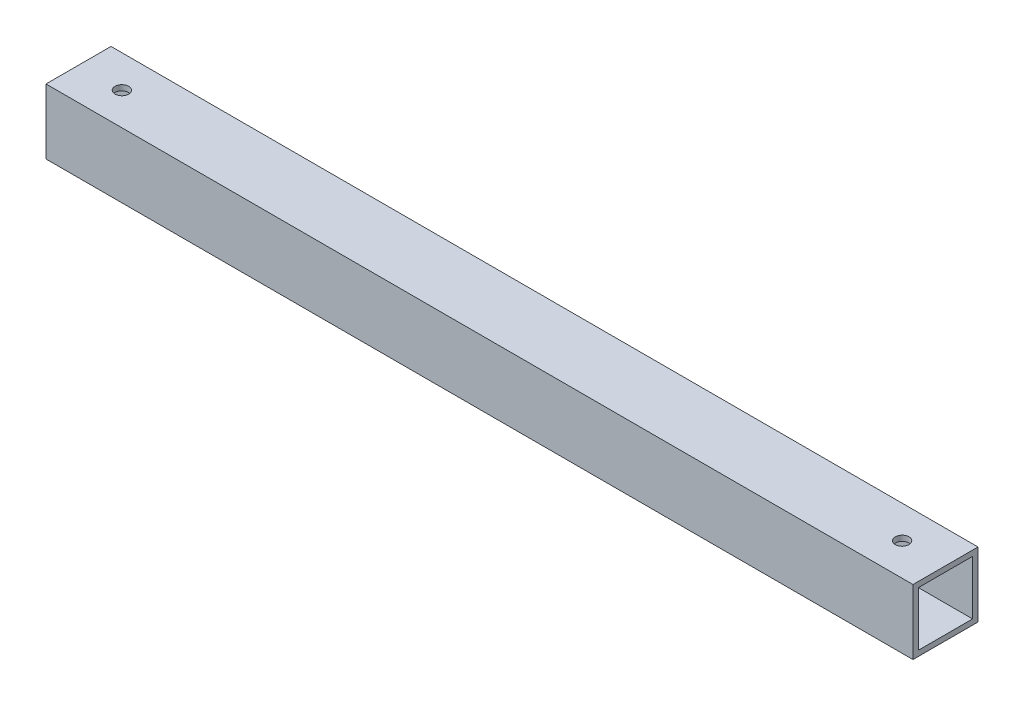
ISO-10303-21;
HEADER;
FILE_DESCRIPTION(('STEP AP214'),'2;1');
FILE_NAME('part.step','',(''),(''),'','','');
FILE_SCHEMA(('AUTOMOTIVE_DESIGN { 1 0 10303 214 1 1 1 1 }'));
ENDSEC;
DATA;
#1=APPLICATION_CONTEXT('core data for automotive mechanical design processes');
#2=APPLICATION_PROTOCOL_DEFINITION('international standard','automotive_design',2000,#1);
#3=PRODUCT_CONTEXT('',#1,'mechanical');
#4=PRODUCT('Part','Part','',(#3));
#5=PRODUCT_RELATED_PRODUCT_CATEGORY('part','',(#4));
#6=PRODUCT_DEFINITION_FORMATION('','',#4);
#7=PRODUCT_DEFINITION_CONTEXT('part definition',#1,'design');
#8=PRODUCT_DEFINITION('design','',#6,#7);
#9=PRODUCT_DEFINITION_SHAPE('','',#8);
#10=(LENGTH_UNIT() NAMED_UNIT(*) SI_UNIT(.MILLI.,.METRE.));
#11=(NAMED_UNIT(*) PLANE_ANGLE_UNIT() SI_UNIT($,.RADIAN.));
#12=(NAMED_UNIT(*) SI_UNIT($,.STERADIAN.) SOLID_ANGLE_UNIT());
#13=UNCERTAINTY_MEASURE_WITH_UNIT(LENGTH_MEASURE(1.E-05),#10,'distance_accuracy_value','');
#14=(GEOMETRIC_REPRESENTATION_CONTEXT(3) GLOBAL_UNCERTAINTY_ASSIGNED_CONTEXT((#13)) GLOBAL_UNIT_ASSIGNED_CONTEXT((#10,
#11,#12)) REPRESENTATION_CONTEXT('',''));
#15=CARTESIAN_POINT('',(0.,0.,0.));
#16=DIRECTION('',(0.,0.,1.));
#17=DIRECTION('',(1.,0.,0.));
#18=AXIS2_PLACEMENT_3D('',#15,#16,#17);
#19=CARTESIAN_POINT('',(254.,0.,0.));
#20=DIRECTION('',(-1.,0.,0.));
#21=DIRECTION('',(0.,0.,1.));
#22=AXIS2_PLACEMENT_3D('',#19,#20,#21);
#23=PLANE('',#22);
#24=DIRECTION('',(0.,1.,0.));
#25=VECTOR('',#24,1.);
#26=CARTESIAN_POINT('',(254.,-9.525,-9.525));
#27=LINE('',#26,#25);
#28=CARTESIAN_POINT('',(254.,-9.525,-9.525));
#29=VERTEX_POINT('',#28);
#30=CARTESIAN_POINT('',(254.,9.525,-9.525));
#31=VERTEX_POINT('',#30);
#32=EDGE_CURVE('E137',#29,#31,#27,.T.);
#33=ORIENTED_EDGE('',*,*,#32,.T.);
#34=DIRECTION('',(0.,0.,1.));
#35=VECTOR('',#34,1.);
#36=CARTESIAN_POINT('',(254.,9.525,9.525));
#37=LINE('',#36,#35);
#38=CARTESIAN_POINT('',(254.,9.525,9.525));
#39=VERTEX_POINT('',#38);
#40=EDGE_CURVE('E140',#31,#39,#37,.T.);
#41=ORIENTED_EDGE('',*,*,#40,.T.);
#42=DIRECTION('',(0.,-1.,0.));
#43=VECTOR('',#42,1.);
#44=CARTESIAN_POINT('',(254.,-9.525,9.525));
#45=LINE('',#44,#43);
#46=CARTESIAN_POINT('',(254.,-9.525,9.525));
#47=VERTEX_POINT('',#46);
#48=EDGE_CURVE('E143',#39,#47,#45,.T.);
#49=ORIENTED_EDGE('',*,*,#48,.T.);
#50=DIRECTION('',(0.,0.,-1.));
#51=VECTOR('',#50,1.);
#52=CARTESIAN_POINT('',(254.,-9.525,9.525));
#53=LINE('',#52,#51);
#54=EDGE_CURVE('E145',#47,#29,#53,.T.);
#55=ORIENTED_EDGE('',*,*,#54,.T.);
#56=EDGE_LOOP('',(#33,#41,#49,#55));
#57=FACE_BOUND('',#56,.T.);
#58=DIRECTION('',(0.,1.,0.));
#59=VECTOR('',#58,1.);
#60=CARTESIAN_POINT('',(254.,-7.9375,-7.9375));
#61=LINE('',#60,#59);
#62=CARTESIAN_POINT('',(254.,-7.9375,-7.9375));
#63=VERTEX_POINT('',#62);
#64=CARTESIAN_POINT('',(254.,7.9375,-7.9375));
#65=VERTEX_POINT('',#64);
#66=EDGE_CURVE('E99',#63,#65,#61,.T.);
#67=ORIENTED_EDGE('',*,*,#66,.F.);
#68=DIRECTION('',(0.,0.,-1.));
#69=VECTOR('',#68,1.);
#70=CARTESIAN_POINT('',(254.,-7.9375,7.9375));
#71=LINE('',#70,#69);
#72=CARTESIAN_POINT('',(254.,-7.9375,7.9375));
#73=VERTEX_POINT('',#72);
#74=EDGE_CURVE('E121',#73,#63,#71,.T.);
#75=ORIENTED_EDGE('',*,*,#74,.F.);
#76=DIRECTION('',(0.,-1.,0.));
#77=VECTOR('',#76,1.);
#78=CARTESIAN_POINT('',(254.,-7.9375,7.9375));
#79=LINE('',#78,#77);
#80=CARTESIAN_POINT('',(254.,7.9375,7.9375));
#81=VERTEX_POINT('',#80);
#82=EDGE_CURVE('E119',#81,#73,#79,.T.);
#83=ORIENTED_EDGE('',*,*,#82,.F.);
#84=DIRECTION('',(0.,0.,1.));
#85=VECTOR('',#84,1.);
#86=CARTESIAN_POINT('',(254.,7.9375,7.9375));
#87=LINE('',#86,#85);
#88=EDGE_CURVE('E107',#65,#81,#87,.T.);
#89=ORIENTED_EDGE('',*,*,#88,.F.);
#90=EDGE_LOOP('',(#67,#75,#83,#89));
#91=FACE_BOUND('',#90,.T.);
#92=ADVANCED_FACE('F32',(#57,#91),#23,.F.);
#93=CARTESIAN_POINT('',(0.,0.,0.));
#94=DIRECTION('',(-1.,0.,0.));
#95=DIRECTION('',(0.,0.,1.));
#96=AXIS2_PLACEMENT_3D('',#93,#94,#95);
#97=PLANE('',#96);
#98=DIRECTION('',(0.,1.,0.));
#99=VECTOR('',#98,1.);
#100=CARTESIAN_POINT('',(0.,-9.525,-9.525));
#101=LINE('',#100,#99);
#102=CARTESIAN_POINT('',(0.,-9.525,-9.525));
#103=VERTEX_POINT('',#102);
#104=CARTESIAN_POINT('',(0.,9.525,-9.525));
#105=VERTEX_POINT('',#104);
#106=EDGE_CURVE('E115',#103,#105,#101,.T.);
#107=ORIENTED_EDGE('',*,*,#106,.F.);
#108=DIRECTION('',(0.,0.,-1.));
#109=VECTOR('',#108,1.);
#110=CARTESIAN_POINT('',(0.,-9.525,9.525));
#111=LINE('',#110,#109);
#112=CARTESIAN_POINT('',(0.,-9.525,9.525));
#113=VERTEX_POINT('',#112);
#114=EDGE_CURVE('E141',#113,#103,#111,.T.);
#115=ORIENTED_EDGE('',*,*,#114,.F.);
#116=DIRECTION('',(0.,-1.,0.));
#117=VECTOR('',#116,1.);
#118=CARTESIAN_POINT('',(0.,-9.525,9.525));
#119=LINE('',#118,#117);
#120=CARTESIAN_POINT('',(0.,9.525,9.525));
#121=VERTEX_POINT('',#120);
#122=EDGE_CURVE('E152',#121,#113,#119,.T.);
#123=ORIENTED_EDGE('',*,*,#122,.F.);
#124=DIRECTION('',(0.,0.,1.));
#125=VECTOR('',#124,1.);
#126=CARTESIAN_POINT('',(0.,9.525,9.525));
#127=LINE('',#126,#125);
#128=EDGE_CURVE('E150',#105,#121,#127,.T.);
#129=ORIENTED_EDGE('',*,*,#128,.F.);
#130=EDGE_LOOP('',(#107,#115,#123,#129));
#131=FACE_BOUND('',#130,.T.);
#132=DIRECTION('',(0.,0.,-1.));
#133=VECTOR('',#132,1.);
#134=CARTESIAN_POINT('',(0.,-7.9375,7.9375));
#135=LINE('',#134,#133);
#136=CARTESIAN_POINT('',(0.,-7.9375,7.9375));
#137=VERTEX_POINT('',#136);
#138=CARTESIAN_POINT('',(0.,-7.9375,-7.9375));
#139=VERTEX_POINT('',#138);
#140=EDGE_CURVE('E108',#137,#139,#135,.T.);
#141=ORIENTED_EDGE('',*,*,#140,.T.);
#142=DIRECTION('',(0.,1.,0.));
#143=VECTOR('',#142,1.);
#144=CARTESIAN_POINT('',(0.,-7.9375,-7.9375));
#145=LINE('',#144,#143);
#146=CARTESIAN_POINT('',(0.,7.9375,-7.9375));
#147=VERTEX_POINT('',#146);
#148=EDGE_CURVE('E57',#139,#147,#145,.T.);
#149=ORIENTED_EDGE('',*,*,#148,.T.);
#150=DIRECTION('',(0.,0.,1.));
#151=VECTOR('',#150,1.);
#152=CARTESIAN_POINT('',(0.,7.9375,7.9375));
#153=LINE('',#152,#151);
#154=CARTESIAN_POINT('',(0.,7.9375,7.9375));
#155=VERTEX_POINT('',#154);
#156=EDGE_CURVE('E114',#147,#155,#153,.T.);
#157=ORIENTED_EDGE('',*,*,#156,.T.);
#158=DIRECTION('',(0.,-1.,0.));
#159=VECTOR('',#158,1.);
#160=CARTESIAN_POINT('',(0.,-7.9375,7.9375));
#161=LINE('',#160,#159);
#162=EDGE_CURVE('E129',#155,#137,#161,.T.);
#163=ORIENTED_EDGE('',*,*,#162,.T.);
#164=EDGE_LOOP('',(#141,#149,#157,#163));
#165=FACE_BOUND('',#164,.T.);
#166=ADVANCED_FACE('F199',(#131,#165),#97,.T.);
#167=CARTESIAN_POINT('',(254.,-9.525,-9.525));
#168=DIRECTION('',(0.,0.,1.));
#169=DIRECTION('',(1.,0.,0.));
#170=AXIS2_PLACEMENT_3D('',#167,#168,#169);
#171=PLANE('',#170);
#172=ORIENTED_EDGE('',*,*,#106,.T.);
#173=DIRECTION('',(-1.,0.,0.));
#174=VECTOR('',#173,1.);
#175=CARTESIAN_POINT('',(254.,9.525,-9.525));
#176=LINE('',#175,#174);
#177=EDGE_CURVE('E11',#31,#105,#176,.T.);
#178=ORIENTED_EDGE('',*,*,#177,.F.);
#179=ORIENTED_EDGE('',*,*,#32,.F.);
#180=DIRECTION('',(-1.,0.,0.));
#181=VECTOR('',#180,1.);
#182=CARTESIAN_POINT('',(254.,-9.525,-9.525));
#183=LINE('',#182,#181);
#184=EDGE_CURVE('E147',#29,#103,#183,.T.);
#185=ORIENTED_EDGE('',*,*,#184,.T.);
#186=EDGE_LOOP('',(#172,#178,#179,#185));
#187=FACE_BOUND('',#186,.T.);
#188=ADVANCED_FACE('F34',(#187),#171,.F.);
#189=CARTESIAN_POINT('',(254.,9.525,9.525));
#190=DIRECTION('',(0.,-1.,0.));
#191=DIRECTION('',(0.,0.,-1.));
#192=AXIS2_PLACEMENT_3D('',#189,#190,#191);
#193=PLANE('',#192);
#194=CARTESIAN_POINT('',(241.3,9.525,0.));
#195=DIRECTION('',(0.,1.,0.));
#196=DIRECTION('',(0.,0.,1.));
#197=AXIS2_PLACEMENT_3D('',#194,#195,#196);
#198=CIRCLE('',#197,2.);
#199=CARTESIAN_POINT('',(241.3,9.525,2.));
#200=VERTEX_POINT('',#199);
#201=EDGE_CURVE('E178',#200,#200,#198,.T.);
#202=ORIENTED_EDGE('',*,*,#201,.F.);
#203=EDGE_LOOP('',(#202));
#204=FACE_BOUND('',#203,.T.);
#205=CARTESIAN_POINT('',(12.7,9.525,0.));
#206=DIRECTION('',(0.,1.,0.));
#207=DIRECTION('',(0.,0.,1.));
#208=AXIS2_PLACEMENT_3D('',#205,#206,#207);
#209=CIRCLE('',#208,2.);
#210=CARTESIAN_POINT('',(12.7,9.525,2.));
#211=VERTEX_POINT('',#210);
#212=EDGE_CURVE('E168',#211,#211,#209,.T.);
#213=ORIENTED_EDGE('',*,*,#212,.F.);
#214=EDGE_LOOP('',(#213));
#215=FACE_BOUND('',#214,.T.);
#216=ORIENTED_EDGE('',*,*,#128,.T.);
#217=DIRECTION('',(-1.,0.,0.));
#218=VECTOR('',#217,1.);
#219=CARTESIAN_POINT('',(254.,9.525,9.525));
#220=LINE('',#219,#218);
#221=EDGE_CURVE('E41',#39,#121,#220,.T.);
#222=ORIENTED_EDGE('',*,*,#221,.F.);
#223=ORIENTED_EDGE('',*,*,#40,.F.);
#224=ORIENTED_EDGE('',*,*,#177,.T.);
#225=EDGE_LOOP('',(#216,#222,#223,#224));
#226=FACE_BOUND('',#225,.T.);
#227=ADVANCED_FACE('F223',(#204,#215,#226),#193,.F.);
#228=CARTESIAN_POINT('',(254.,-9.525,9.525));
#229=DIRECTION('',(0.,0.,-1.));
#230=DIRECTION('',(-1.,0.,0.));
#231=AXIS2_PLACEMENT_3D('',#228,#229,#230);
#232=PLANE('',#231);
#233=ORIENTED_EDGE('',*,*,#122,.T.);
#234=DIRECTION('',(-1.,0.,0.));
#235=VECTOR('',#234,1.);
#236=CARTESIAN_POINT('',(254.,-9.525,9.525));
#237=LINE('',#236,#235);
#238=EDGE_CURVE('E157',#47,#113,#237,.T.);
#239=ORIENTED_EDGE('',*,*,#238,.F.);
#240=ORIENTED_EDGE('',*,*,#48,.F.);
#241=ORIENTED_EDGE('',*,*,#221,.T.);
#242=EDGE_LOOP('',(#233,#239,#240,#241));
#243=FACE_BOUND('',#242,.T.);
#244=ADVANCED_FACE('F221',(#243),#232,.F.);
#245=CARTESIAN_POINT('',(254.,-9.525,9.525));
#246=DIRECTION('',(0.,1.,0.));
#247=DIRECTION('',(0.,0.,1.));
#248=AXIS2_PLACEMENT_3D('',#245,#246,#247);
#249=PLANE('',#248);
#250=CARTESIAN_POINT('',(241.3,-9.525,0.));
#251=DIRECTION('',(0.,1.,0.));
#252=DIRECTION('',(0.,0.,1.));
#253=AXIS2_PLACEMENT_3D('',#250,#251,#252);
#254=CIRCLE('',#253,2.);
#255=CARTESIAN_POINT('',(241.3,-9.525,2.));
#256=VERTEX_POINT('',#255);
#257=EDGE_CURVE('E181',#256,#256,#254,.T.);
#258=ORIENTED_EDGE('',*,*,#257,.T.);
#259=EDGE_LOOP('',(#258));
#260=FACE_BOUND('',#259,.T.);
#261=CARTESIAN_POINT('',(12.7,-9.525,0.));
#262=DIRECTION('',(0.,1.,0.));
#263=DIRECTION('',(0.,0.,1.));
#264=AXIS2_PLACEMENT_3D('',#261,#262,#263);
#265=CIRCLE('',#264,2.);
#266=CARTESIAN_POINT('',(12.7,-9.525,2.));
#267=VERTEX_POINT('',#266);
#268=EDGE_CURVE('E163',#267,#267,#265,.T.);
#269=ORIENTED_EDGE('',*,*,#268,.T.);
#270=EDGE_LOOP('',(#269));
#271=FACE_BOUND('',#270,.T.);
#272=ORIENTED_EDGE('',*,*,#114,.T.);
#273=ORIENTED_EDGE('',*,*,#184,.F.);
#274=ORIENTED_EDGE('',*,*,#54,.F.);
#275=ORIENTED_EDGE('',*,*,#238,.T.);
#276=EDGE_LOOP('',(#272,#273,#274,#275));
#277=FACE_BOUND('',#276,.T.);
#278=ADVANCED_FACE('F218',(#260,#271,#277),#249,.F.);
#279=CARTESIAN_POINT('',(254.,-7.9375,-7.9375));
#280=DIRECTION('',(0.,0.,1.));
#281=DIRECTION('',(1.,0.,0.));
#282=AXIS2_PLACEMENT_3D('',#279,#280,#281);
#283=PLANE('',#282);
#284=ORIENTED_EDGE('',*,*,#148,.F.);
#285=DIRECTION('',(-1.,0.,0.));
#286=VECTOR('',#285,1.);
#287=CARTESIAN_POINT('',(254.,-7.9375,-7.9375));
#288=LINE('',#287,#286);
#289=EDGE_CURVE('E103',#63,#139,#288,.T.);
#290=ORIENTED_EDGE('',*,*,#289,.F.);
#291=ORIENTED_EDGE('',*,*,#66,.T.);
#292=DIRECTION('',(-1.,0.,0.));
#293=VECTOR('',#292,1.);
#294=CARTESIAN_POINT('',(254.,7.9375,-7.9375));
#295=LINE('',#294,#293);
#296=EDGE_CURVE('E102',#65,#147,#295,.T.);
#297=ORIENTED_EDGE('',*,*,#296,.T.);
#298=EDGE_LOOP('',(#284,#290,#291,#297));
#299=FACE_BOUND('',#298,.T.);
#300=ADVANCED_FACE('F101',(#299),#283,.T.);
#301=CARTESIAN_POINT('',(254.,7.9375,7.9375));
#302=DIRECTION('',(0.,-1.,0.));
#303=DIRECTION('',(0.,0.,-1.));
#304=AXIS2_PLACEMENT_3D('',#301,#302,#303);
#305=PLANE('',#304);
#306=CARTESIAN_POINT('',(241.3,7.9375,0.));
#307=DIRECTION('',(0.,-1.,0.));
#308=DIRECTION('',(0.,0.,-1.));
#309=AXIS2_PLACEMENT_3D('',#306,#307,#308);
#310=CIRCLE('',#309,2.);
#311=CARTESIAN_POINT('',(241.3,7.9375,-2.));
#312=VERTEX_POINT('',#311);
#313=EDGE_CURVE('E173',#312,#312,#310,.T.);
#314=ORIENTED_EDGE('',*,*,#313,.F.);
#315=EDGE_LOOP('',(#314));
#316=FACE_BOUND('',#315,.T.);
#317=CARTESIAN_POINT('',(12.7,7.9375,0.));
#318=DIRECTION('',(0.,-1.,0.));
#319=DIRECTION('',(0.,0.,-1.));
#320=AXIS2_PLACEMENT_3D('',#317,#318,#319);
#321=CIRCLE('',#320,2.);
#322=CARTESIAN_POINT('',(12.7,7.9375,-2.));
#323=VERTEX_POINT('',#322);
#324=EDGE_CURVE('E127',#323,#323,#321,.T.);
#325=ORIENTED_EDGE('',*,*,#324,.F.);
#326=EDGE_LOOP('',(#325));
#327=FACE_BOUND('',#326,.T.);
#328=ORIENTED_EDGE('',*,*,#156,.F.);
#329=ORIENTED_EDGE('',*,*,#296,.F.);
#330=ORIENTED_EDGE('',*,*,#88,.T.);
#331=DIRECTION('',(-1.,0.,0.));
#332=VECTOR('',#331,1.);
#333=CARTESIAN_POINT('',(254.,7.9375,7.9375));
#334=LINE('',#333,#332);
#335=EDGE_CURVE('E116',#81,#155,#334,.T.);
#336=ORIENTED_EDGE('',*,*,#335,.T.);
#337=EDGE_LOOP('',(#328,#329,#330,#336));
#338=FACE_BOUND('',#337,.T.);
#339=ADVANCED_FACE('F111',(#316,#327,#338),#305,.T.);
#340=CARTESIAN_POINT('',(254.,-7.9375,7.9375));
#341=DIRECTION('',(0.,0.,-1.));
#342=DIRECTION('',(-1.,0.,0.));
#343=AXIS2_PLACEMENT_3D('',#340,#341,#342);
#344=PLANE('',#343);
#345=ORIENTED_EDGE('',*,*,#162,.F.);
#346=ORIENTED_EDGE('',*,*,#335,.F.);
#347=ORIENTED_EDGE('',*,*,#82,.T.);
#348=DIRECTION('',(-1.,0.,0.));
#349=VECTOR('',#348,1.);
#350=CARTESIAN_POINT('',(254.,-7.9375,7.9375));
#351=LINE('',#350,#349);
#352=EDGE_CURVE('E49',#73,#137,#351,.T.);
#353=ORIENTED_EDGE('',*,*,#352,.T.);
#354=EDGE_LOOP('',(#345,#346,#347,#353));
#355=FACE_BOUND('',#354,.T.);
#356=ADVANCED_FACE('F195',(#355),#344,.T.);
#357=CARTESIAN_POINT('',(254.,-7.9375,7.9375));
#358=DIRECTION('',(0.,1.,0.));
#359=DIRECTION('',(0.,0.,1.));
#360=AXIS2_PLACEMENT_3D('',#357,#358,#359);
#361=PLANE('',#360);
#362=CARTESIAN_POINT('',(241.3,-7.9375,0.));
#363=DIRECTION('',(0.,1.,0.));
#364=DIRECTION('',(0.,0.,1.));
#365=AXIS2_PLACEMENT_3D('',#362,#363,#364);
#366=CIRCLE('',#365,2.);
#367=CARTESIAN_POINT('',(241.3,-7.9375,2.));
#368=VERTEX_POINT('',#367);
#369=EDGE_CURVE('E36',#368,#368,#366,.T.);
#370=ORIENTED_EDGE('',*,*,#369,.F.);
#371=EDGE_LOOP('',(#370));
#372=FACE_BOUND('',#371,.T.);
#373=CARTESIAN_POINT('',(12.7,-7.9375,0.));
#374=DIRECTION('',(0.,1.,0.));
#375=DIRECTION('',(0.,0.,1.));
#376=AXIS2_PLACEMENT_3D('',#373,#374,#375);
#377=CIRCLE('',#376,2.);
#378=CARTESIAN_POINT('',(12.7,-7.9375,2.));
#379=VERTEX_POINT('',#378);
#380=EDGE_CURVE('E161',#379,#379,#377,.T.);
#381=ORIENTED_EDGE('',*,*,#380,.F.);
#382=EDGE_LOOP('',(#381));
#383=FACE_BOUND('',#382,.T.);
#384=ORIENTED_EDGE('',*,*,#140,.F.);
#385=ORIENTED_EDGE('',*,*,#352,.F.);
#386=ORIENTED_EDGE('',*,*,#74,.T.);
#387=ORIENTED_EDGE('',*,*,#289,.T.);
#388=EDGE_LOOP('',(#384,#385,#386,#387));
#389=FACE_BOUND('',#388,.T.);
#390=ADVANCED_FACE('F191',(#372,#383,#389),#361,.T.);
#391=CARTESIAN_POINT('',(12.7,-9.525,0.));
#392=DIRECTION('',(0.,1.,0.));
#393=DIRECTION('',(0.,0.,1.));
#394=AXIS2_PLACEMENT_3D('',#391,#392,#393);
#395=CYLINDRICAL_SURFACE('',#394,2.);
#396=ORIENTED_EDGE('',*,*,#380,.T.);
#397=EDGE_LOOP('',(#396));
#398=FACE_BOUND('',#397,.T.);
#399=ORIENTED_EDGE('',*,*,#268,.F.);
#400=EDGE_LOOP('',(#399));
#401=FACE_BOUND('',#400,.T.);
#402=ADVANCED_FACE('F194',(#398,#401),#395,.F.);
#403=ORIENTED_EDGE('',*,*,#324,.T.);
#404=EDGE_LOOP('',(#403));
#405=FACE_BOUND('',#404,.T.);
#406=ORIENTED_EDGE('',*,*,#212,.T.);
#407=EDGE_LOOP('',(#406));
#408=FACE_BOUND('',#407,.T.);
#409=ADVANCED_FACE('F247',(#405,#408),#395,.F.);
#410=CARTESIAN_POINT('',(241.3,-9.525,0.));
#411=DIRECTION('',(0.,1.,0.));
#412=DIRECTION('',(0.,0.,1.));
#413=AXIS2_PLACEMENT_3D('',#410,#411,#412);
#414=CYLINDRICAL_SURFACE('',#413,2.);
#415=ORIENTED_EDGE('',*,*,#369,.T.);
#416=EDGE_LOOP('',(#415));
#417=FACE_BOUND('',#416,.T.);
#418=ORIENTED_EDGE('',*,*,#257,.F.);
#419=EDGE_LOOP('',(#418));
#420=FACE_BOUND('',#419,.T.);
#421=ADVANCED_FACE('F188',(#417,#420),#414,.F.);
#422=ORIENTED_EDGE('',*,*,#313,.T.);
#423=EDGE_LOOP('',(#422));
#424=FACE_BOUND('',#423,.T.);
#425=ORIENTED_EDGE('',*,*,#201,.T.);
#426=EDGE_LOOP('',(#425));
#427=FACE_BOUND('',#426,.T.);
#428=ADVANCED_FACE('F255',(#424,#427),#414,.F.);
#429=CLOSED_SHELL('',(#92,#166,#188,#227,#244,#278,#300,#339,#356,#390,#402,#409,#421,#428));
#430=MANIFOLD_SOLID_BREP('B2',#429);
#431=ADVANCED_BREP_SHAPE_REPRESENTATION('',(#18,#430),#14);
#432=SHAPE_DEFINITION_REPRESENTATION(#9,#431);
ENDSEC;
END-ISO-10303-21;
